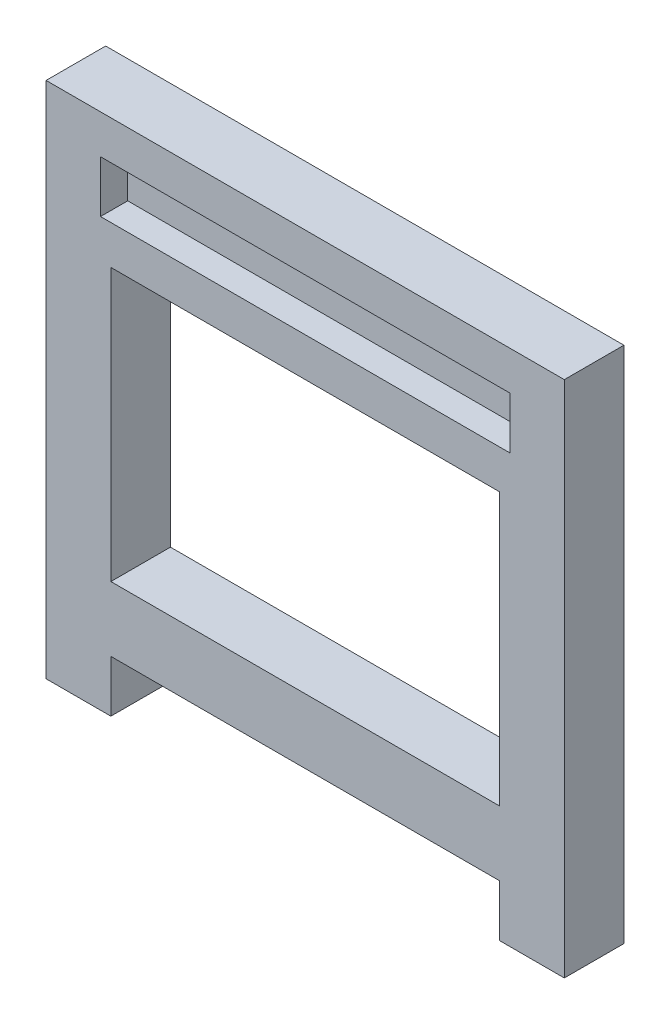
ISO-10303-21;
HEADER;
FILE_DESCRIPTION(('STEP AP214'),'2;1');
FILE_NAME('part.step','',(''),(''),'','','');
FILE_SCHEMA(('AUTOMOTIVE_DESIGN { 1 0 10303 214 1 1 1 1 }'));
ENDSEC;
DATA;
#1=APPLICATION_CONTEXT('core data for automotive mechanical design processes');
#2=APPLICATION_PROTOCOL_DEFINITION('international standard','automotive_design',2000,#1);
#3=PRODUCT_CONTEXT('',#1,'mechanical');
#4=PRODUCT('Part','Part','',(#3));
#5=PRODUCT_RELATED_PRODUCT_CATEGORY('part','',(#4));
#6=PRODUCT_DEFINITION_FORMATION('','',#4);
#7=PRODUCT_DEFINITION_CONTEXT('part definition',#1,'design');
#8=PRODUCT_DEFINITION('design','',#6,#7);
#9=PRODUCT_DEFINITION_SHAPE('','',#8);
#10=(LENGTH_UNIT() NAMED_UNIT(*) SI_UNIT(.MILLI.,.METRE.));
#11=(NAMED_UNIT(*) PLANE_ANGLE_UNIT() SI_UNIT($,.RADIAN.));
#12=(NAMED_UNIT(*) SI_UNIT($,.STERADIAN.) SOLID_ANGLE_UNIT());
#13=UNCERTAINTY_MEASURE_WITH_UNIT(LENGTH_MEASURE(1.E-05),#10,'distance_accuracy_value','');
#14=(GEOMETRIC_REPRESENTATION_CONTEXT(3) GLOBAL_UNCERTAINTY_ASSIGNED_CONTEXT((#13)) GLOBAL_UNIT_ASSIGNED_CONTEXT((#10,
#11,#12)) REPRESENTATION_CONTEXT('',''));
#15=CARTESIAN_POINT('',(0.,0.,0.));
#16=DIRECTION('',(0.,0.,1.));
#17=DIRECTION('',(1.,0.,0.));
#18=AXIS2_PLACEMENT_3D('',#15,#16,#17);
#19=CARTESIAN_POINT('',(2.1,14.5,2.3));
#20=DIRECTION('',(1.,0.,0.));
#21=DIRECTION('',(0.,0.,-1.));
#22=AXIS2_PLACEMENT_3D('',#19,#20,#21);
#23=PLANE('',#22);
#24=DIRECTION('',(0.,0.,-1.));
#25=VECTOR('',#24,1.);
#26=CARTESIAN_POINT('',(2.1,14.5,2.3));
#27=LINE('',#26,#25);
#28=CARTESIAN_POINT('',(2.1,14.5,2.3));
#29=VERTEX_POINT('',#28);
#30=CARTESIAN_POINT('',(2.1,14.5,1.25));
#31=VERTEX_POINT('',#30);
#32=EDGE_CURVE('E170',#29,#31,#27,.T.);
#33=ORIENTED_EDGE('',*,*,#32,.T.);
#34=DIRECTION('',(0.,1.,0.));
#35=VECTOR('',#34,1.);
#36=CARTESIAN_POINT('',(2.1,14.5,1.25));
#37=LINE('',#36,#35);
#38=CARTESIAN_POINT('',(2.1,16.5,1.25));
#39=VERTEX_POINT('',#38);
#40=EDGE_CURVE('E159',#31,#39,#37,.T.);
#41=ORIENTED_EDGE('',*,*,#40,.T.);
#42=DIRECTION('',(0.,0.,-1.));
#43=VECTOR('',#42,1.);
#44=CARTESIAN_POINT('',(2.1,16.5,2.3));
#45=LINE('',#44,#43);
#46=CARTESIAN_POINT('',(2.1,16.5,2.3));
#47=VERTEX_POINT('',#46);
#48=EDGE_CURVE('E167',#47,#39,#45,.T.);
#49=ORIENTED_EDGE('',*,*,#48,.F.);
#50=DIRECTION('',(0.,-1.,0.));
#51=VECTOR('',#50,1.);
#52=CARTESIAN_POINT('',(2.1,14.5,2.3));
#53=LINE('',#52,#51);
#54=EDGE_CURVE('E529',#47,#29,#53,.T.);
#55=ORIENTED_EDGE('',*,*,#54,.T.);
#56=EDGE_LOOP('',(#33,#41,#49,#55));
#57=FACE_BOUND('',#56,.T.);
#58=ADVANCED_FACE('F45',(#57),#23,.T.);
#59=CARTESIAN_POINT('',(2.1,14.5,2.3));
#60=DIRECTION('',(0.,1.,0.));
#61=DIRECTION('',(0.,0.,1.));
#62=AXIS2_PLACEMENT_3D('',#59,#60,#61);
#63=PLANE('',#62);
#64=DIRECTION('',(0.,0.,-1.));
#65=VECTOR('',#64,1.);
#66=CARTESIAN_POINT('',(17.9,14.5,2.3));
#67=LINE('',#66,#65);
#68=CARTESIAN_POINT('',(17.9,14.5,2.3));
#69=VERTEX_POINT('',#68);
#70=CARTESIAN_POINT('',(17.9,14.5,1.25));
#71=VERTEX_POINT('',#70);
#72=EDGE_CURVE('E180',#69,#71,#67,.T.);
#73=ORIENTED_EDGE('',*,*,#72,.T.);
#74=DIRECTION('',(1.,0.,0.));
#75=VECTOR('',#74,1.);
#76=CARTESIAN_POINT('',(2.1,14.5,1.25));
#77=LINE('',#76,#75);
#78=EDGE_CURVE('E531',#31,#71,#77,.T.);
#79=ORIENTED_EDGE('',*,*,#78,.F.);
#80=ORIENTED_EDGE('',*,*,#32,.F.);
#81=DIRECTION('',(1.,0.,0.));
#82=VECTOR('',#81,1.);
#83=CARTESIAN_POINT('',(2.1,14.5,2.3));
#84=LINE('',#83,#82);
#85=EDGE_CURVE('E528',#29,#69,#84,.T.);
#86=ORIENTED_EDGE('',*,*,#85,.T.);
#87=EDGE_LOOP('',(#73,#79,#80,#86));
#88=FACE_BOUND('',#87,.T.);
#89=ADVANCED_FACE('F361',(#88),#63,.T.);
#90=CARTESIAN_POINT('',(17.9,14.5,2.3));
#91=DIRECTION('',(-1.,0.,0.));
#92=DIRECTION('',(0.,0.,1.));
#93=AXIS2_PLACEMENT_3D('',#90,#91,#92);
#94=PLANE('',#93);
#95=DIRECTION('',(0.,0.,-1.));
#96=VECTOR('',#95,1.);
#97=CARTESIAN_POINT('',(17.9,16.5,2.3));
#98=LINE('',#97,#96);
#99=CARTESIAN_POINT('',(17.9,16.5,2.3));
#100=VERTEX_POINT('',#99);
#101=CARTESIAN_POINT('',(17.9,16.5,1.25));
#102=VERTEX_POINT('',#101);
#103=EDGE_CURVE('E68',#100,#102,#98,.T.);
#104=ORIENTED_EDGE('',*,*,#103,.T.);
#105=DIRECTION('',(0.,1.,0.));
#106=VECTOR('',#105,1.);
#107=CARTESIAN_POINT('',(17.9,14.5,1.25));
#108=LINE('',#107,#106);
#109=EDGE_CURVE('E61',#71,#102,#108,.T.);
#110=ORIENTED_EDGE('',*,*,#109,.F.);
#111=ORIENTED_EDGE('',*,*,#72,.F.);
#112=DIRECTION('',(0.,1.,0.));
#113=VECTOR('',#112,1.);
#114=CARTESIAN_POINT('',(17.9,14.5,2.3));
#115=LINE('',#114,#113);
#116=EDGE_CURVE('E182',#69,#100,#115,.T.);
#117=ORIENTED_EDGE('',*,*,#116,.T.);
#118=EDGE_LOOP('',(#104,#110,#111,#117));
#119=FACE_BOUND('',#118,.T.);
#120=ADVANCED_FACE('F367',(#119),#94,.T.);
#121=CARTESIAN_POINT('',(2.1,16.5,2.3));
#122=DIRECTION('',(0.,-1.,0.));
#123=DIRECTION('',(0.,0.,-1.));
#124=AXIS2_PLACEMENT_3D('',#121,#122,#123);
#125=PLANE('',#124);
#126=ORIENTED_EDGE('',*,*,#48,.T.);
#127=DIRECTION('',(1.,0.,0.));
#128=VECTOR('',#127,1.);
#129=CARTESIAN_POINT('',(2.1,16.5,1.25));
#130=LINE('',#129,#128);
#131=EDGE_CURVE('E156',#39,#102,#130,.T.);
#132=ORIENTED_EDGE('',*,*,#131,.T.);
#133=ORIENTED_EDGE('',*,*,#103,.F.);
#134=DIRECTION('',(-1.,0.,0.));
#135=VECTOR('',#134,1.);
#136=CARTESIAN_POINT('',(2.1,16.5,2.3));
#137=LINE('',#136,#135);
#138=EDGE_CURVE('E175',#100,#47,#137,.T.);
#139=ORIENTED_EDGE('',*,*,#138,.T.);
#140=EDGE_LOOP('',(#126,#132,#133,#139));
#141=FACE_BOUND('',#140,.T.);
#142=ADVANCED_FACE('F173',(#141),#125,.T.);
#143=CARTESIAN_POINT('',(0.,0.,2.3));
#144=DIRECTION('',(0.,0.,-1.));
#145=DIRECTION('',(-1.,0.,0.));
#146=AXIS2_PLACEMENT_3D('',#143,#144,#145);
#147=PLANE('',#146);
#148=DIRECTION('',(0.,1.,0.));
#149=VECTOR('',#148,1.);
#150=CARTESIAN_POINT('',(17.5,2.5,2.3));
#151=LINE('',#150,#149);
#152=CARTESIAN_POINT('',(17.5,2.5,2.3));
#153=VERTEX_POINT('',#152);
#154=CARTESIAN_POINT('',(17.5,13.,2.3));
#155=VERTEX_POINT('',#154);
#156=EDGE_CURVE('E192',#153,#155,#151,.T.);
#157=ORIENTED_EDGE('',*,*,#156,.F.);
#158=DIRECTION('',(1.,0.,0.));
#159=VECTOR('',#158,1.);
#160=CARTESIAN_POINT('',(2.5,2.5,2.3));
#161=LINE('',#160,#159);
#162=CARTESIAN_POINT('',(2.5,2.5,2.3));
#163=VERTEX_POINT('',#162);
#164=EDGE_CURVE('E203',#163,#153,#161,.T.);
#165=ORIENTED_EDGE('',*,*,#164,.F.);
#166=DIRECTION('',(0.,-1.,0.));
#167=VECTOR('',#166,1.);
#168=CARTESIAN_POINT('',(2.5,2.5,2.3));
#169=LINE('',#168,#167);
#170=CARTESIAN_POINT('',(2.5,13.,2.3));
#171=VERTEX_POINT('',#170);
#172=EDGE_CURVE('E199',#171,#163,#169,.T.);
#173=ORIENTED_EDGE('',*,*,#172,.F.);
#174=DIRECTION('',(-1.,0.,0.));
#175=VECTOR('',#174,1.);
#176=CARTESIAN_POINT('',(2.5,13.,2.3));
#177=LINE('',#176,#175);
#178=EDGE_CURVE('E195',#155,#171,#177,.T.);
#179=ORIENTED_EDGE('',*,*,#178,.F.);
#180=EDGE_LOOP('',(#157,#165,#173,#179));
#181=FACE_BOUND('',#180,.T.);
#182=DIRECTION('',(0.,-1.,0.));
#183=VECTOR('',#182,1.);
#184=CARTESIAN_POINT('',(0.,0.,2.3));
#185=LINE('',#184,#183);
#186=CARTESIAN_POINT('',(0.,18.,2.3));
#187=VERTEX_POINT('',#186);
#188=CARTESIAN_POINT('',(0.,-2.,2.3));
#189=VERTEX_POINT('',#188);
#190=EDGE_CURVE('E235',#187,#189,#185,.T.);
#191=ORIENTED_EDGE('',*,*,#190,.T.);
#192=DIRECTION('',(1.,0.,0.));
#193=VECTOR('',#192,1.);
#194=CARTESIAN_POINT('',(0.,-2.,2.3));
#195=LINE('',#194,#193);
#196=CARTESIAN_POINT('',(2.5,-2.,2.3));
#197=VERTEX_POINT('',#196);
#198=EDGE_CURVE('E238',#189,#197,#195,.T.);
#199=ORIENTED_EDGE('',*,*,#198,.T.);
#200=DIRECTION('',(0.,1.,0.));
#201=VECTOR('',#200,1.);
#202=CARTESIAN_POINT('',(2.5,-2.,2.3));
#203=LINE('',#202,#201);
#204=CARTESIAN_POINT('',(2.5,0.,2.3));
#205=VERTEX_POINT('',#204);
#206=EDGE_CURVE('E242',#197,#205,#203,.T.);
#207=ORIENTED_EDGE('',*,*,#206,.T.);
#208=DIRECTION('',(1.,0.,0.));
#209=VECTOR('',#208,1.);
#210=CARTESIAN_POINT('',(2.5,0.,2.3));
#211=LINE('',#210,#209);
#212=CARTESIAN_POINT('',(17.5,0.,2.3));
#213=VERTEX_POINT('',#212);
#214=EDGE_CURVE('E245',#205,#213,#211,.T.);
#215=ORIENTED_EDGE('',*,*,#214,.T.);
#216=DIRECTION('',(0.,-1.,0.));
#217=VECTOR('',#216,1.);
#218=CARTESIAN_POINT('',(17.5,-2.,2.3));
#219=LINE('',#218,#217);
#220=CARTESIAN_POINT('',(17.5,-2.,2.3));
#221=VERTEX_POINT('',#220);
#222=EDGE_CURVE('E248',#213,#221,#219,.T.);
#223=ORIENTED_EDGE('',*,*,#222,.T.);
#224=DIRECTION('',(1.,0.,0.));
#225=VECTOR('',#224,1.);
#226=CARTESIAN_POINT('',(20.,-2.,2.3));
#227=LINE('',#226,#225);
#228=CARTESIAN_POINT('',(20.,-2.,2.3));
#229=VERTEX_POINT('',#228);
#230=EDGE_CURVE('E251',#221,#229,#227,.T.);
#231=ORIENTED_EDGE('',*,*,#230,.T.);
#232=DIRECTION('',(0.,1.,0.));
#233=VECTOR('',#232,1.);
#234=CARTESIAN_POINT('',(20.,0.,2.3));
#235=LINE('',#234,#233);
#236=CARTESIAN_POINT('',(20.,18.,2.3));
#237=VERTEX_POINT('',#236);
#238=EDGE_CURVE('E254',#229,#237,#235,.T.);
#239=ORIENTED_EDGE('',*,*,#238,.T.);
#240=DIRECTION('',(-1.,0.,0.));
#241=VECTOR('',#240,1.);
#242=CARTESIAN_POINT('',(0.,18.,2.3));
#243=LINE('',#242,#241);
#244=EDGE_CURVE('E257',#237,#187,#243,.T.);
#245=ORIENTED_EDGE('',*,*,#244,.T.);
#246=EDGE_LOOP('',(#191,#199,#207,#215,#223,#231,#239,#245));
#247=FACE_BOUND('',#246,.T.);
#248=ORIENTED_EDGE('',*,*,#54,.F.);
#249=ORIENTED_EDGE('',*,*,#138,.F.);
#250=ORIENTED_EDGE('',*,*,#116,.F.);
#251=ORIENTED_EDGE('',*,*,#85,.F.);
#252=EDGE_LOOP('',(#248,#249,#250,#251));
#253=FACE_BOUND('',#252,.T.);
#254=ADVANCED_FACE('F334',(#181,#247,#253),#147,.F.);
#255=CARTESIAN_POINT('',(0.,0.,0.));
#256=DIRECTION('',(0.,0.,-1.));
#257=DIRECTION('',(-1.,0.,0.));
#258=AXIS2_PLACEMENT_3D('',#255,#256,#257);
#259=PLANE('',#258);
#260=DIRECTION('',(0.,-1.,0.));
#261=VECTOR('',#260,1.);
#262=CARTESIAN_POINT('',(0.,0.,0.));
#263=LINE('',#262,#261);
#264=CARTESIAN_POINT('',(0.,18.,0.));
#265=VERTEX_POINT('',#264);
#266=CARTESIAN_POINT('',(0.,-2.,0.));
#267=VERTEX_POINT('',#266);
#268=EDGE_CURVE('E234',#265,#267,#263,.T.);
#269=ORIENTED_EDGE('',*,*,#268,.F.);
#270=DIRECTION('',(-1.,0.,0.));
#271=VECTOR('',#270,1.);
#272=CARTESIAN_POINT('',(0.,18.,0.));
#273=LINE('',#272,#271);
#274=CARTESIAN_POINT('',(20.,18.,0.));
#275=VERTEX_POINT('',#274);
#276=EDGE_CURVE('E239',#275,#265,#273,.T.);
#277=ORIENTED_EDGE('',*,*,#276,.F.);
#278=DIRECTION('',(0.,1.,0.));
#279=VECTOR('',#278,1.);
#280=CARTESIAN_POINT('',(20.,0.,0.));
#281=LINE('',#280,#279);
#282=CARTESIAN_POINT('',(20.,-2.,0.));
#283=VERTEX_POINT('',#282);
#284=EDGE_CURVE('E279',#283,#275,#281,.T.);
#285=ORIENTED_EDGE('',*,*,#284,.F.);
#286=DIRECTION('',(1.,0.,0.));
#287=VECTOR('',#286,1.);
#288=CARTESIAN_POINT('',(20.,-2.,0.));
#289=LINE('',#288,#287);
#290=CARTESIAN_POINT('',(17.5,-2.,0.));
#291=VERTEX_POINT('',#290);
#292=EDGE_CURVE('E275',#291,#283,#289,.T.);
#293=ORIENTED_EDGE('',*,*,#292,.F.);
#294=DIRECTION('',(0.,-1.,0.));
#295=VECTOR('',#294,1.);
#296=CARTESIAN_POINT('',(17.5,-2.,0.));
#297=LINE('',#296,#295);
#298=CARTESIAN_POINT('',(17.5,0.,0.));
#299=VERTEX_POINT('',#298);
#300=EDGE_CURVE('E272',#299,#291,#297,.T.);
#301=ORIENTED_EDGE('',*,*,#300,.F.);
#302=DIRECTION('',(1.,0.,0.));
#303=VECTOR('',#302,1.);
#304=CARTESIAN_POINT('',(2.5,0.,0.));
#305=LINE('',#304,#303);
#306=CARTESIAN_POINT('',(2.5,0.,0.));
#307=VERTEX_POINT('',#306);
#308=EDGE_CURVE('E269',#307,#299,#305,.T.);
#309=ORIENTED_EDGE('',*,*,#308,.F.);
#310=DIRECTION('',(0.,1.,0.));
#311=VECTOR('',#310,1.);
#312=CARTESIAN_POINT('',(2.5,-2.,0.));
#313=LINE('',#312,#311);
#314=CARTESIAN_POINT('',(2.5,-2.,0.));
#315=VERTEX_POINT('',#314);
#316=EDGE_CURVE('E266',#315,#307,#313,.T.);
#317=ORIENTED_EDGE('',*,*,#316,.F.);
#318=DIRECTION('',(1.,0.,0.));
#319=VECTOR('',#318,1.);
#320=CARTESIAN_POINT('',(0.,-2.,0.));
#321=LINE('',#320,#319);
#322=EDGE_CURVE('E263',#267,#315,#321,.T.);
#323=ORIENTED_EDGE('',*,*,#322,.F.);
#324=EDGE_LOOP('',(#269,#277,#285,#293,#301,#309,#317,#323));
#325=FACE_BOUND('',#324,.T.);
#326=DIRECTION('',(1.,0.,0.));
#327=VECTOR('',#326,1.);
#328=CARTESIAN_POINT('',(2.5,2.5,0.));
#329=LINE('',#328,#327);
#330=CARTESIAN_POINT('',(2.5,2.5,0.));
#331=VERTEX_POINT('',#330);
#332=CARTESIAN_POINT('',(17.5,2.5,0.));
#333=VERTEX_POINT('',#332);
#334=EDGE_CURVE('E196',#331,#333,#329,.T.);
#335=ORIENTED_EDGE('',*,*,#334,.T.);
#336=DIRECTION('',(0.,1.,0.));
#337=VECTOR('',#336,1.);
#338=CARTESIAN_POINT('',(17.5,2.5,0.));
#339=LINE('',#338,#337);
#340=CARTESIAN_POINT('',(17.5,13.,0.));
#341=VERTEX_POINT('',#340);
#342=EDGE_CURVE('E191',#333,#341,#339,.T.);
#343=ORIENTED_EDGE('',*,*,#342,.T.);
#344=DIRECTION('',(-1.,0.,0.));
#345=VECTOR('',#344,1.);
#346=CARTESIAN_POINT('',(2.5,13.,0.));
#347=LINE('',#346,#345);
#348=CARTESIAN_POINT('',(2.5,13.,0.));
#349=VERTEX_POINT('',#348);
#350=EDGE_CURVE('E210',#341,#349,#347,.T.);
#351=ORIENTED_EDGE('',*,*,#350,.T.);
#352=DIRECTION('',(0.,-1.,0.));
#353=VECTOR('',#352,1.);
#354=CARTESIAN_POINT('',(2.5,2.5,0.));
#355=LINE('',#354,#353);
#356=EDGE_CURVE('E214',#349,#331,#355,.T.);
#357=ORIENTED_EDGE('',*,*,#356,.T.);
#358=EDGE_LOOP('',(#335,#343,#351,#357));
#359=FACE_BOUND('',#358,.T.);
#360=ADVANCED_FACE('F320',(#325,#359),#259,.T.);
#361=CARTESIAN_POINT('',(0.,0.,2.3));
#362=DIRECTION('',(1.,0.,0.));
#363=DIRECTION('',(0.,1.,0.));
#364=AXIS2_PLACEMENT_3D('',#361,#362,#363);
#365=PLANE('',#364);
#366=ORIENTED_EDGE('',*,*,#268,.T.);
#367=DIRECTION('',(0.,0.,-1.));
#368=VECTOR('',#367,1.);
#369=CARTESIAN_POINT('',(0.,-2.,2.3));
#370=LINE('',#369,#368);
#371=EDGE_CURVE('E11',#189,#267,#370,.T.);
#372=ORIENTED_EDGE('',*,*,#371,.F.);
#373=ORIENTED_EDGE('',*,*,#190,.F.);
#374=DIRECTION('',(0.,0.,-1.));
#375=VECTOR('',#374,1.);
#376=CARTESIAN_POINT('',(0.,18.,2.3));
#377=LINE('',#376,#375);
#378=EDGE_CURVE('E260',#187,#265,#377,.T.);
#379=ORIENTED_EDGE('',*,*,#378,.T.);
#380=EDGE_LOOP('',(#366,#372,#373,#379));
#381=FACE_BOUND('',#380,.T.);
#382=ADVANCED_FACE('F47',(#381),#365,.F.);
#383=CARTESIAN_POINT('',(0.,-2.,2.3));
#384=DIRECTION('',(0.,1.,0.));
#385=DIRECTION('',(0.,0.,1.));
#386=AXIS2_PLACEMENT_3D('',#383,#384,#385);
#387=PLANE('',#386);
#388=ORIENTED_EDGE('',*,*,#322,.T.);
#389=DIRECTION('',(0.,0.,-1.));
#390=VECTOR('',#389,1.);
#391=CARTESIAN_POINT('',(2.5,-2.,2.3));
#392=LINE('',#391,#390);
#393=EDGE_CURVE('E54',#197,#315,#392,.T.);
#394=ORIENTED_EDGE('',*,*,#393,.F.);
#395=ORIENTED_EDGE('',*,*,#198,.F.);
#396=ORIENTED_EDGE('',*,*,#371,.T.);
#397=EDGE_LOOP('',(#388,#394,#395,#396));
#398=FACE_BOUND('',#397,.T.);
#399=ADVANCED_FACE('F339',(#398),#387,.F.);
#400=CARTESIAN_POINT('',(2.5,-2.,2.3));
#401=DIRECTION('',(-1.,0.,0.));
#402=DIRECTION('',(0.,0.,1.));
#403=AXIS2_PLACEMENT_3D('',#400,#401,#402);
#404=PLANE('',#403);
#405=ORIENTED_EDGE('',*,*,#316,.T.);
#406=DIRECTION('',(0.,0.,-1.));
#407=VECTOR('',#406,1.);
#408=CARTESIAN_POINT('',(2.5,0.,2.3));
#409=LINE('',#408,#407);
#410=EDGE_CURVE('E304',#205,#307,#409,.T.);
#411=ORIENTED_EDGE('',*,*,#410,.F.);
#412=ORIENTED_EDGE('',*,*,#206,.F.);
#413=ORIENTED_EDGE('',*,*,#393,.T.);
#414=EDGE_LOOP('',(#405,#411,#412,#413));
#415=FACE_BOUND('',#414,.T.);
#416=ADVANCED_FACE('F313',(#415),#404,.F.);
#417=CARTESIAN_POINT('',(2.5,0.,2.3));
#418=DIRECTION('',(0.,1.,0.));
#419=DIRECTION('',(-1.,0.,0.));
#420=AXIS2_PLACEMENT_3D('',#417,#418,#419);
#421=PLANE('',#420);
#422=ORIENTED_EDGE('',*,*,#308,.T.);
#423=DIRECTION('',(0.,0.,-1.));
#424=VECTOR('',#423,1.);
#425=CARTESIAN_POINT('',(17.5,0.,2.3));
#426=LINE('',#425,#424);
#427=EDGE_CURVE('E300',#213,#299,#426,.T.);
#428=ORIENTED_EDGE('',*,*,#427,.F.);
#429=ORIENTED_EDGE('',*,*,#214,.F.);
#430=ORIENTED_EDGE('',*,*,#410,.T.);
#431=EDGE_LOOP('',(#422,#428,#429,#430));
#432=FACE_BOUND('',#431,.T.);
#433=ADVANCED_FACE('F326',(#432),#421,.F.);
#434=CARTESIAN_POINT('',(17.5,-2.,2.3));
#435=DIRECTION('',(1.,0.,0.));
#436=DIRECTION('',(0.,0.,-1.));
#437=AXIS2_PLACEMENT_3D('',#434,#435,#436);
#438=PLANE('',#437);
#439=ORIENTED_EDGE('',*,*,#300,.T.);
#440=DIRECTION('',(0.,0.,-1.));
#441=VECTOR('',#440,1.);
#442=CARTESIAN_POINT('',(17.5,-2.,2.3));
#443=LINE('',#442,#441);
#444=EDGE_CURVE('E296',#221,#291,#443,.T.);
#445=ORIENTED_EDGE('',*,*,#444,.F.);
#446=ORIENTED_EDGE('',*,*,#222,.F.);
#447=ORIENTED_EDGE('',*,*,#427,.T.);
#448=EDGE_LOOP('',(#439,#445,#446,#447));
#449=FACE_BOUND('',#448,.T.);
#450=ADVANCED_FACE('F330',(#449),#438,.F.);
#451=CARTESIAN_POINT('',(20.,-2.,2.3));
#452=DIRECTION('',(0.,1.,0.));
#453=DIRECTION('',(-1.,0.,0.));
#454=AXIS2_PLACEMENT_3D('',#451,#452,#453);
#455=PLANE('',#454);
#456=ORIENTED_EDGE('',*,*,#292,.T.);
#457=DIRECTION('',(0.,0.,-1.));
#458=VECTOR('',#457,1.);
#459=CARTESIAN_POINT('',(20.,-2.,2.3));
#460=LINE('',#459,#458);
#461=EDGE_CURVE('E292',#229,#283,#460,.T.);
#462=ORIENTED_EDGE('',*,*,#461,.F.);
#463=ORIENTED_EDGE('',*,*,#230,.F.);
#464=ORIENTED_EDGE('',*,*,#444,.T.);
#465=EDGE_LOOP('',(#456,#462,#463,#464));
#466=FACE_BOUND('',#465,.T.);
#467=ADVANCED_FACE('F351',(#466),#455,.F.);
#468=CARTESIAN_POINT('',(20.,0.,2.3));
#469=DIRECTION('',(-1.,0.,0.));
#470=DIRECTION('',(0.,0.,1.));
#471=AXIS2_PLACEMENT_3D('',#468,#469,#470);
#472=PLANE('',#471);
#473=ORIENTED_EDGE('',*,*,#284,.T.);
#474=DIRECTION('',(0.,0.,-1.));
#475=VECTOR('',#474,1.);
#476=CARTESIAN_POINT('',(20.,18.,2.3));
#477=LINE('',#476,#475);
#478=EDGE_CURVE('E288',#237,#275,#477,.T.);
#479=ORIENTED_EDGE('',*,*,#478,.F.);
#480=ORIENTED_EDGE('',*,*,#238,.F.);
#481=ORIENTED_EDGE('',*,*,#461,.T.);
#482=EDGE_LOOP('',(#473,#479,#480,#481));
#483=FACE_BOUND('',#482,.T.);
#484=ADVANCED_FACE('F349',(#483),#472,.F.);
#485=CARTESIAN_POINT('',(0.,18.,2.3));
#486=DIRECTION('',(0.,-1.,0.));
#487=DIRECTION('',(0.,0.,-1.));
#488=AXIS2_PLACEMENT_3D('',#485,#486,#487);
#489=PLANE('',#488);
#490=ORIENTED_EDGE('',*,*,#276,.T.);
#491=ORIENTED_EDGE('',*,*,#378,.F.);
#492=ORIENTED_EDGE('',*,*,#244,.F.);
#493=ORIENTED_EDGE('',*,*,#478,.T.);
#494=EDGE_LOOP('',(#490,#491,#492,#493));
#495=FACE_BOUND('',#494,.T.);
#496=ADVANCED_FACE('F344',(#495),#489,.F.);
#497=CARTESIAN_POINT('',(17.5,2.5,2.3));
#498=DIRECTION('',(-1.,0.,0.));
#499=DIRECTION('',(0.,0.,1.));
#500=AXIS2_PLACEMENT_3D('',#497,#498,#499);
#501=PLANE('',#500);
#502=ORIENTED_EDGE('',*,*,#342,.F.);
#503=DIRECTION('',(0.,0.,-1.));
#504=VECTOR('',#503,1.);
#505=CARTESIAN_POINT('',(17.5,2.5,2.3));
#506=LINE('',#505,#504);
#507=EDGE_CURVE('E206',#153,#333,#506,.T.);
#508=ORIENTED_EDGE('',*,*,#507,.F.);
#509=ORIENTED_EDGE('',*,*,#156,.T.);
#510=DIRECTION('',(0.,0.,-1.));
#511=VECTOR('',#510,1.);
#512=CARTESIAN_POINT('',(17.5,13.,2.3));
#513=LINE('',#512,#511);
#514=EDGE_CURVE('E230',#155,#341,#513,.T.);
#515=ORIENTED_EDGE('',*,*,#514,.T.);
#516=EDGE_LOOP('',(#502,#508,#509,#515));
#517=FACE_BOUND('',#516,.T.);
#518=ADVANCED_FACE('F382',(#517),#501,.T.);
#519=CARTESIAN_POINT('',(2.5,13.,2.3));
#520=DIRECTION('',(0.,-1.,0.));
#521=DIRECTION('',(0.,0.,-1.));
#522=AXIS2_PLACEMENT_3D('',#519,#520,#521);
#523=PLANE('',#522);
#524=ORIENTED_EDGE('',*,*,#350,.F.);
#525=ORIENTED_EDGE('',*,*,#514,.F.);
#526=ORIENTED_EDGE('',*,*,#178,.T.);
#527=DIRECTION('',(0.,0.,-1.));
#528=VECTOR('',#527,1.);
#529=CARTESIAN_POINT('',(2.5,13.,2.3));
#530=LINE('',#529,#528);
#531=EDGE_CURVE('E227',#171,#349,#530,.T.);
#532=ORIENTED_EDGE('',*,*,#531,.T.);
#533=EDGE_LOOP('',(#524,#525,#526,#532));
#534=FACE_BOUND('',#533,.T.);
#535=ADVANCED_FACE('F378',(#534),#523,.T.);
#536=CARTESIAN_POINT('',(2.5,2.5,2.3));
#537=DIRECTION('',(1.,0.,0.));
#538=DIRECTION('',(0.,0.,-1.));
#539=AXIS2_PLACEMENT_3D('',#536,#537,#538);
#540=PLANE('',#539);
#541=ORIENTED_EDGE('',*,*,#356,.F.);
#542=ORIENTED_EDGE('',*,*,#531,.F.);
#543=ORIENTED_EDGE('',*,*,#172,.T.);
#544=DIRECTION('',(0.,0.,-1.));
#545=VECTOR('',#544,1.);
#546=CARTESIAN_POINT('',(2.5,2.5,2.3));
#547=LINE('',#546,#545);
#548=EDGE_CURVE('E224',#163,#331,#547,.T.);
#549=ORIENTED_EDGE('',*,*,#548,.T.);
#550=EDGE_LOOP('',(#541,#542,#543,#549));
#551=FACE_BOUND('',#550,.T.);
#552=ADVANCED_FACE('F374',(#551),#540,.T.);
#553=CARTESIAN_POINT('',(2.5,2.5,2.3));
#554=DIRECTION('',(0.,1.,0.));
#555=DIRECTION('',(-1.,0.,0.));
#556=AXIS2_PLACEMENT_3D('',#553,#554,#555);
#557=PLANE('',#556);
#558=ORIENTED_EDGE('',*,*,#334,.F.);
#559=ORIENTED_EDGE('',*,*,#548,.F.);
#560=ORIENTED_EDGE('',*,*,#164,.T.);
#561=ORIENTED_EDGE('',*,*,#507,.T.);
#562=EDGE_LOOP('',(#558,#559,#560,#561));
#563=FACE_BOUND('',#562,.T.);
#564=ADVANCED_FACE('F372',(#563),#557,.T.);
#565=CARTESIAN_POINT('',(0.,0.,1.25));
#566=DIRECTION('',(0.,0.,-1.));
#567=DIRECTION('',(-1.,0.,0.));
#568=AXIS2_PLACEMENT_3D('',#565,#566,#567);
#569=PLANE('',#568);
#570=ORIENTED_EDGE('',*,*,#40,.F.);
#571=ORIENTED_EDGE('',*,*,#78,.T.);
#572=ORIENTED_EDGE('',*,*,#109,.T.);
#573=ORIENTED_EDGE('',*,*,#131,.F.);
#574=EDGE_LOOP('',(#570,#571,#572,#573));
#575=FACE_BOUND('',#574,.T.);
#576=ADVANCED_FACE('F158',(#575),#569,.F.);
#577=CLOSED_SHELL('',(#58,#89,#120,#142,#254,#360,#382,#399,#416,#433,#450,#467,#484,#496,#518,
#535,#552,#564,#576));
#578=MANIFOLD_SOLID_BREP('B2',#577);
#579=ADVANCED_BREP_SHAPE_REPRESENTATION('',(#18,#578),#14);
#580=SHAPE_DEFINITION_REPRESENTATION(#9,#579);
ENDSEC;
END-ISO-10303-21;
